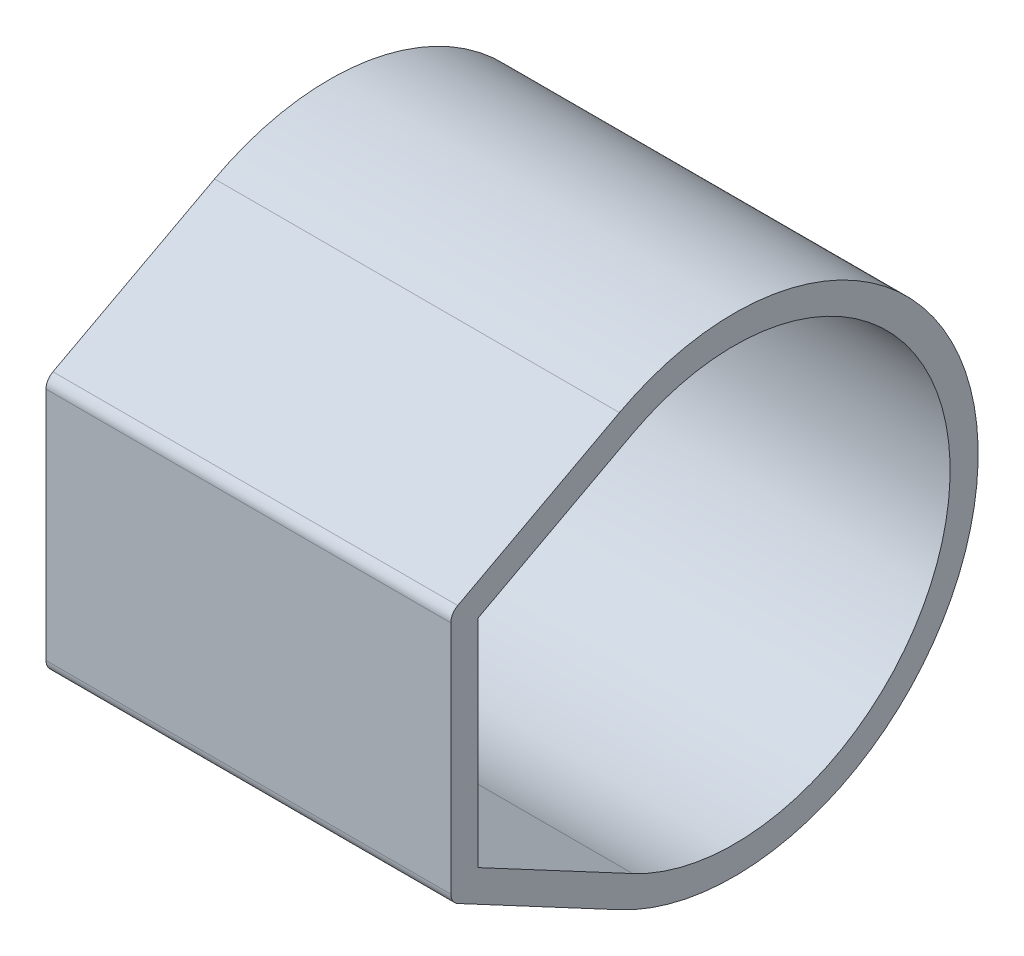
ISO-10303-21;
HEADER;
FILE_DESCRIPTION(('STEP AP214'),'2;1');
FILE_NAME('part.step','',(''),(''),'','','');
FILE_SCHEMA(('AUTOMOTIVE_DESIGN { 1 0 10303 214 1 1 1 1 }'));
ENDSEC;
DATA;
#1=APPLICATION_CONTEXT('core data for automotive mechanical design processes');
#2=APPLICATION_PROTOCOL_DEFINITION('international standard','automotive_design',2000,#1);
#3=PRODUCT_CONTEXT('',#1,'mechanical');
#4=PRODUCT('Part','Part','',(#3));
#5=PRODUCT_RELATED_PRODUCT_CATEGORY('part','',(#4));
#6=PRODUCT_DEFINITION_FORMATION('','',#4);
#7=PRODUCT_DEFINITION_CONTEXT('part definition',#1,'design');
#8=PRODUCT_DEFINITION('design','',#6,#7);
#9=PRODUCT_DEFINITION_SHAPE('','',#8);
#10=(LENGTH_UNIT() NAMED_UNIT(*) SI_UNIT(.MILLI.,.METRE.));
#11=(NAMED_UNIT(*) PLANE_ANGLE_UNIT() SI_UNIT($,.RADIAN.));
#12=(NAMED_UNIT(*) SI_UNIT($,.STERADIAN.) SOLID_ANGLE_UNIT());
#13=UNCERTAINTY_MEASURE_WITH_UNIT(LENGTH_MEASURE(1.E-05),#10,'distance_accuracy_value','');
#14=(GEOMETRIC_REPRESENTATION_CONTEXT(3) GLOBAL_UNCERTAINTY_ASSIGNED_CONTEXT((#13)) GLOBAL_UNIT_ASSIGNED_CONTEXT((#10,
#11,#12)) REPRESENTATION_CONTEXT('',''));
#15=CARTESIAN_POINT('',(0.,0.,0.));
#16=DIRECTION('',(0.,0.,1.));
#17=DIRECTION('',(1.,0.,0.));
#18=AXIS2_PLACEMENT_3D('',#15,#16,#17);
#19=CARTESIAN_POINT('',(-139.007123161513,665.110935184198,-377.797185138635));
#20=DIRECTION('',(-1.,0.,0.));
#21=DIRECTION('',(0.,0.,1.));
#22=AXIS2_PLACEMENT_3D('',#19,#20,#21);
#23=CYLINDRICAL_SURFACE('',#22,9.03898198734247);
#24=CARTESIAN_POINT('',(-154.007123161513,665.110935184198,-377.797185138635));
#25=DIRECTION('',(-1.,0.,0.));
#26=DIRECTION('',(0.,0.,1.));
#27=AXIS2_PLACEMENT_3D('',#24,#25,#26);
#28=CIRCLE('',#27,9.03898198734247);
#29=CARTESIAN_POINT('',(-154.007123161513,673.08650752597,-373.543546556356));
#30=VERTEX_POINT('',#29);
#31=CARTESIAN_POINT('',(-154.007123161513,657.135362842425,-373.543546556356));
#32=VERTEX_POINT('',#31);
#33=EDGE_CURVE('E164',#30,#32,#28,.T.);
#34=ORIENTED_EDGE('',*,*,#33,.F.);
#35=DIRECTION('',(-1.,0.,0.));
#36=VECTOR('',#35,1.);
#37=CARTESIAN_POINT('',(-139.007123161513,673.08650752597,-373.543546556356));
#38=LINE('',#37,#36);
#39=CARTESIAN_POINT('',(-139.007123161513,673.08650752597,-373.543546556356));
#40=VERTEX_POINT('',#39);
#41=EDGE_CURVE('E11',#40,#30,#38,.T.);
#42=ORIENTED_EDGE('',*,*,#41,.F.);
#43=CARTESIAN_POINT('',(-139.007123161513,665.110935184198,-377.797185138635));
#44=DIRECTION('',(-1.,0.,0.));
#45=DIRECTION('',(0.,0.,1.));
#46=AXIS2_PLACEMENT_3D('',#43,#44,#45);
#47=CIRCLE('',#46,9.03898198734247);
#48=CARTESIAN_POINT('',(-139.007123161513,657.135362842425,-373.543546556356));
#49=VERTEX_POINT('',#48);
#50=EDGE_CURVE('E170',#40,#49,#47,.T.);
#51=ORIENTED_EDGE('',*,*,#50,.T.);
#52=DIRECTION('',(-1.,0.,0.));
#53=VECTOR('',#52,1.);
#54=CARTESIAN_POINT('',(-139.007123161513,657.135362842425,-373.543546556356));
#55=LINE('',#54,#53);
#56=EDGE_CURVE('E46',#49,#32,#55,.T.);
#57=ORIENTED_EDGE('',*,*,#56,.T.);
#58=EDGE_LOOP('',(#34,#42,#51,#57));
#59=FACE_BOUND('',#58,.T.);
#60=ADVANCED_FACE('F43',(#59),#23,.T.);
#61=CARTESIAN_POINT('',(-139.007123161513,669.892133468441,-367.554095198489));
#62=DIRECTION('',(0.,0.882352941176468,0.470588235294123));
#63=DIRECTION('',(0.,-0.470588235294123,0.882352941176468));
#64=AXIS2_PLACEMENT_3D('',#61,#62,#63);
#65=PLANE('',#64);
#66=DIRECTION('',(0.,0.470588235294123,-0.882352941176468));
#67=VECTOR('',#66,1.);
#68=CARTESIAN_POINT('',(-154.007123161513,669.892133468441,-367.554095198489));
#69=LINE('',#68,#67);
#70=CARTESIAN_POINT('',(-154.007123161513,669.892133468441,-367.554095198489));
#71=VERTEX_POINT('',#70);
#72=EDGE_CURVE('E175',#71,#30,#69,.T.);
#73=ORIENTED_EDGE('',*,*,#72,.F.);
#74=DIRECTION('',(-1.,0.,0.));
#75=VECTOR('',#74,1.);
#76=CARTESIAN_POINT('',(-139.007123161513,669.892133468441,-367.554095198489));
#77=LINE('',#76,#75);
#78=CARTESIAN_POINT('',(-139.007123161513,669.892133468441,-367.554095198489));
#79=VERTEX_POINT('',#78);
#80=EDGE_CURVE('E52',#79,#71,#77,.T.);
#81=ORIENTED_EDGE('',*,*,#80,.F.);
#82=DIRECTION('',(0.,0.470588235294123,-0.882352941176468));
#83=VECTOR('',#82,1.);
#84=CARTESIAN_POINT('',(-139.007123161513,669.892133468441,-367.554095198489));
#85=LINE('',#84,#83);
#86=EDGE_CURVE('E191',#79,#40,#85,.T.);
#87=ORIENTED_EDGE('',*,*,#86,.T.);
#88=ORIENTED_EDGE('',*,*,#41,.T.);
#89=EDGE_LOOP('',(#73,#81,#87,#88));
#90=FACE_BOUND('',#89,.T.);
#91=ADVANCED_FACE('F240',(#90),#65,.T.);
#92=CARTESIAN_POINT('',(-139.007123161513,669.463950035351,-367.782459696137));
#93=DIRECTION('',(-1.,0.,0.));
#94=DIRECTION('',(0.,0.,1.));
#95=AXIS2_PLACEMENT_3D('',#92,#93,#94);
#96=CYLINDRICAL_SURFACE('',#95,0.485274557501719);
#97=CARTESIAN_POINT('',(-154.007123161513,669.463950035351,-367.782459696137));
#98=DIRECTION('',(-1.,0.,0.));
#99=DIRECTION('',(0.,0.,1.));
#100=AXIS2_PLACEMENT_3D('',#97,#98,#99);
#101=CIRCLE('',#100,0.485274557501719);
#102=CARTESIAN_POINT('',(-154.007123161513,669.463950035351,-367.297185138635));
#103=VERTEX_POINT('',#102);
#104=EDGE_CURVE('E210',#103,#71,#101,.T.);
#105=ORIENTED_EDGE('',*,*,#104,.F.);
#106=DIRECTION('',(-1.,0.,0.));
#107=VECTOR('',#106,1.);
#108=CARTESIAN_POINT('',(-139.007123161513,669.463950035351,-367.297185138635));
#109=LINE('',#108,#107);
#110=CARTESIAN_POINT('',(-139.007123161513,669.463950035351,-367.297185138635));
#111=VERTEX_POINT('',#110);
#112=EDGE_CURVE('E219',#111,#103,#109,.T.);
#113=ORIENTED_EDGE('',*,*,#112,.F.);
#114=CARTESIAN_POINT('',(-139.007123161513,669.463950035351,-367.782459696137));
#115=DIRECTION('',(-1.,0.,0.));
#116=DIRECTION('',(0.,0.,1.));
#117=AXIS2_PLACEMENT_3D('',#114,#115,#116);
#118=CIRCLE('',#117,0.485274557501719);
#119=EDGE_CURVE('E187',#111,#79,#118,.T.);
#120=ORIENTED_EDGE('',*,*,#119,.T.);
#121=ORIENTED_EDGE('',*,*,#80,.T.);
#122=EDGE_LOOP('',(#105,#113,#120,#121));
#123=FACE_BOUND('',#122,.T.);
#124=ADVANCED_FACE('F251',(#123),#96,.T.);
#125=CARTESIAN_POINT('',(-139.007123161513,660.757920333044,-367.297185138635));
#126=DIRECTION('',(0.,0.,1.));
#127=DIRECTION('',(1.,0.,0.));
#128=AXIS2_PLACEMENT_3D('',#125,#126,#127);
#129=PLANE('',#128);
#130=DIRECTION('',(0.,1.,0.));
#131=VECTOR('',#130,1.);
#132=CARTESIAN_POINT('',(-154.007123161513,660.757920333044,-367.297185138635));
#133=LINE('',#132,#131);
#134=CARTESIAN_POINT('',(-154.007123161513,660.757920333044,-367.297185138635));
#135=VERTEX_POINT('',#134);
#136=EDGE_CURVE('E206',#135,#103,#133,.T.);
#137=ORIENTED_EDGE('',*,*,#136,.F.);
#138=DIRECTION('',(-1.,0.,0.));
#139=VECTOR('',#138,1.);
#140=CARTESIAN_POINT('',(-139.007123161513,660.757920333044,-367.297185138635));
#141=LINE('',#140,#139);
#142=CARTESIAN_POINT('',(-139.007123161513,660.757920333044,-367.297185138635));
#143=VERTEX_POINT('',#142);
#144=EDGE_CURVE('E222',#143,#135,#141,.T.);
#145=ORIENTED_EDGE('',*,*,#144,.F.);
#146=DIRECTION('',(0.,1.,0.));
#147=VECTOR('',#146,1.);
#148=CARTESIAN_POINT('',(-139.007123161513,660.757920333044,-367.297185138635));
#149=LINE('',#148,#147);
#150=EDGE_CURVE('E183',#143,#111,#149,.T.);
#151=ORIENTED_EDGE('',*,*,#150,.T.);
#152=ORIENTED_EDGE('',*,*,#112,.T.);
#153=EDGE_LOOP('',(#137,#145,#151,#152));
#154=FACE_BOUND('',#153,.T.);
#155=ADVANCED_FACE('F249',(#154),#129,.T.);
#156=CARTESIAN_POINT('',(-139.007123161513,660.757920333044,-367.782459696137));
#157=DIRECTION('',(-1.,0.,0.));
#158=DIRECTION('',(0.,0.,1.));
#159=AXIS2_PLACEMENT_3D('',#156,#157,#158);
#160=CYLINDRICAL_SURFACE('',#159,0.485274557501768);
#161=CARTESIAN_POINT('',(-154.007123161513,660.757920333044,-367.782459696137));
#162=DIRECTION('',(-1.,0.,0.));
#163=DIRECTION('',(0.,0.,1.));
#164=AXIS2_PLACEMENT_3D('',#161,#162,#163);
#165=CIRCLE('',#164,0.485274557501768);
#166=CARTESIAN_POINT('',(-154.007123161513,660.329736899954,-367.554095198489));
#167=VERTEX_POINT('',#166);
#168=EDGE_CURVE('E202',#167,#135,#165,.T.);
#169=ORIENTED_EDGE('',*,*,#168,.F.);
#170=DIRECTION('',(-1.,0.,0.));
#171=VECTOR('',#170,1.);
#172=CARTESIAN_POINT('',(-139.007123161513,660.329736899954,-367.554095198489));
#173=LINE('',#172,#171);
#174=CARTESIAN_POINT('',(-139.007123161513,660.329736899954,-367.554095198489));
#175=VERTEX_POINT('',#174);
#176=EDGE_CURVE('E224',#175,#167,#173,.T.);
#177=ORIENTED_EDGE('',*,*,#176,.F.);
#178=CARTESIAN_POINT('',(-139.007123161513,660.757920333044,-367.782459696137));
#179=DIRECTION('',(-1.,0.,0.));
#180=DIRECTION('',(0.,0.,1.));
#181=AXIS2_PLACEMENT_3D('',#178,#179,#180);
#182=CIRCLE('',#181,0.485274557501768);
#183=EDGE_CURVE('E179',#175,#143,#182,.T.);
#184=ORIENTED_EDGE('',*,*,#183,.T.);
#185=ORIENTED_EDGE('',*,*,#144,.T.);
#186=EDGE_LOOP('',(#169,#177,#184,#185));
#187=FACE_BOUND('',#186,.T.);
#188=ADVANCED_FACE('F246',(#187),#160,.T.);
#189=CARTESIAN_POINT('',(-139.007123161513,657.135362842425,-373.543546556356));
#190=DIRECTION('',(0.,-0.882352941176466,0.470588235294126));
#191=DIRECTION('',(0.,-0.470588235294126,-0.882352941176466));
#192=AXIS2_PLACEMENT_3D('',#189,#190,#191);
#193=PLANE('',#192);
#194=DIRECTION('',(0.,0.470588235294126,0.882352941176466));
#195=VECTOR('',#194,1.);
#196=CARTESIAN_POINT('',(-154.007123161513,657.135362842425,-373.543546556356));
#197=LINE('',#196,#195);
#198=EDGE_CURVE('E198',#32,#167,#197,.T.);
#199=ORIENTED_EDGE('',*,*,#198,.F.);
#200=ORIENTED_EDGE('',*,*,#56,.F.);
#201=DIRECTION('',(0.,0.470588235294126,0.882352941176466));
#202=VECTOR('',#201,1.);
#203=CARTESIAN_POINT('',(-139.007123161513,657.135362842425,-373.543546556356));
#204=LINE('',#203,#202);
#205=EDGE_CURVE('E174',#49,#175,#204,.T.);
#206=ORIENTED_EDGE('',*,*,#205,.T.);
#207=ORIENTED_EDGE('',*,*,#176,.T.);
#208=EDGE_LOOP('',(#199,#200,#206,#207));
#209=FACE_BOUND('',#208,.T.);
#210=ADVANCED_FACE('F234',(#209),#193,.T.);
#211=CARTESIAN_POINT('',(-139.007123161513,665.110935184198,-377.797185138635));
#212=DIRECTION('',(-1.,0.,0.));
#213=DIRECTION('',(0.,0.,1.));
#214=AXIS2_PLACEMENT_3D('',#211,#212,#213);
#215=PLANE('',#214);
#216=DIRECTION('',(0.,0.470588235294119,-0.88235294117647));
#217=VECTOR('',#216,1.);
#218=CARTESIAN_POINT('',(-139.007123161513,672.169758713609,-374.032479256282));
#219=LINE('',#218,#217);
#220=CARTESIAN_POINT('',(-139.007123161513,669.110935184198,-368.297185138635));
#221=VERTEX_POINT('',#220);
#222=CARTESIAN_POINT('',(-139.007123161513,672.169758713609,-374.032479256282));
#223=VERTEX_POINT('',#222);
#224=EDGE_CURVE('E130',#221,#223,#219,.T.);
#225=ORIENTED_EDGE('',*,*,#224,.T.);
#226=CARTESIAN_POINT('',(-139.007123161513,665.110935184198,-377.797185138635));
#227=DIRECTION('',(-1.,0.,0.));
#228=DIRECTION('',(0.,0.,-1.));
#229=AXIS2_PLACEMENT_3D('',#226,#227,#228);
#230=CIRCLE('',#229,7.99999999999996);
#231=CARTESIAN_POINT('',(-139.007123161513,658.052111654786,-374.032479256282));
#232=VERTEX_POINT('',#231);
#233=EDGE_CURVE('E123',#223,#232,#230,.T.);
#234=ORIENTED_EDGE('',*,*,#233,.T.);
#235=DIRECTION('',(0.,0.470588235294103,0.882352941176479));
#236=VECTOR('',#235,1.);
#237=CARTESIAN_POINT('',(-139.007123161513,661.110935184198,-368.297185138635));
#238=LINE('',#237,#236);
#239=CARTESIAN_POINT('',(-139.007123161513,661.110935184197,-368.297185138635));
#240=VERTEX_POINT('',#239);
#241=EDGE_CURVE('E133',#232,#240,#238,.T.);
#242=ORIENTED_EDGE('',*,*,#241,.T.);
#243=DIRECTION('',(0.,1.,0.));
#244=VECTOR('',#243,1.);
#245=CARTESIAN_POINT('',(-139.007123161513,669.110935184198,-368.297185138635));
#246=LINE('',#245,#244);
#247=EDGE_CURVE('E60',#240,#221,#246,.T.);
#248=ORIENTED_EDGE('',*,*,#247,.T.);
#249=EDGE_LOOP('',(#225,#234,#242,#248));
#250=FACE_BOUND('',#249,.T.);
#251=ORIENTED_EDGE('',*,*,#50,.F.);
#252=ORIENTED_EDGE('',*,*,#86,.F.);
#253=ORIENTED_EDGE('',*,*,#119,.F.);
#254=ORIENTED_EDGE('',*,*,#150,.F.);
#255=ORIENTED_EDGE('',*,*,#183,.F.);
#256=ORIENTED_EDGE('',*,*,#205,.F.);
#257=EDGE_LOOP('',(#251,#252,#253,#254,#255,#256));
#258=FACE_BOUND('',#257,.T.);
#259=ADVANCED_FACE('F138',(#250,#258),#215,.F.);
#260=CARTESIAN_POINT('',(-154.007123161513,665.110935184198,-377.797185138635));
#261=DIRECTION('',(-1.,0.,0.));
#262=DIRECTION('',(0.,0.,1.));
#263=AXIS2_PLACEMENT_3D('',#260,#261,#262);
#264=PLANE('',#263);
#265=CARTESIAN_POINT('',(-154.007123161513,665.110935184198,-377.797185138635));
#266=DIRECTION('',(-1.,0.,0.));
#267=DIRECTION('',(0.,0.,-1.));
#268=AXIS2_PLACEMENT_3D('',#265,#266,#267);
#269=CIRCLE('',#268,7.99999999999996);
#270=CARTESIAN_POINT('',(-154.007123161513,672.169758713609,-374.032479256282));
#271=VERTEX_POINT('',#270);
#272=CARTESIAN_POINT('',(-154.007123161513,658.052111654786,-374.032479256282));
#273=VERTEX_POINT('',#272);
#274=EDGE_CURVE('E68',#271,#273,#269,.T.);
#275=ORIENTED_EDGE('',*,*,#274,.F.);
#276=DIRECTION('',(0.,0.470588235294119,-0.88235294117647));
#277=VECTOR('',#276,1.);
#278=CARTESIAN_POINT('',(-154.007123161513,672.169758713609,-374.032479256282));
#279=LINE('',#278,#277);
#280=CARTESIAN_POINT('',(-154.007123161513,669.110935184198,-368.297185138635));
#281=VERTEX_POINT('',#280);
#282=EDGE_CURVE('E142',#281,#271,#279,.T.);
#283=ORIENTED_EDGE('',*,*,#282,.F.);
#284=DIRECTION('',(0.,1.,0.));
#285=VECTOR('',#284,1.);
#286=CARTESIAN_POINT('',(-154.007123161513,669.110935184198,-368.297185138635));
#287=LINE('',#286,#285);
#288=CARTESIAN_POINT('',(-154.007123161513,661.110935184198,-368.297185138635));
#289=VERTEX_POINT('',#288);
#290=EDGE_CURVE('E146',#289,#281,#287,.T.);
#291=ORIENTED_EDGE('',*,*,#290,.F.);
#292=DIRECTION('',(0.,0.470588235294103,0.882352941176479));
#293=VECTOR('',#292,1.);
#294=CARTESIAN_POINT('',(-154.007123161513,661.110935184198,-368.297185138635));
#295=LINE('',#294,#293);
#296=EDGE_CURVE('E155',#273,#289,#295,.T.);
#297=ORIENTED_EDGE('',*,*,#296,.F.);
#298=EDGE_LOOP('',(#275,#283,#291,#297));
#299=FACE_BOUND('',#298,.T.);
#300=ORIENTED_EDGE('',*,*,#33,.T.);
#301=ORIENTED_EDGE('',*,*,#198,.T.);
#302=ORIENTED_EDGE('',*,*,#168,.T.);
#303=ORIENTED_EDGE('',*,*,#136,.T.);
#304=ORIENTED_EDGE('',*,*,#104,.T.);
#305=ORIENTED_EDGE('',*,*,#72,.T.);
#306=EDGE_LOOP('',(#300,#301,#302,#303,#304,#305));
#307=FACE_BOUND('',#306,.T.);
#308=ADVANCED_FACE('F236',(#299,#307),#264,.T.);
#309=CARTESIAN_POINT('',(-139.007123161513,665.110935184198,-377.797185138635));
#310=DIRECTION('',(-1.,0.,0.));
#311=DIRECTION('',(0.,0.,1.));
#312=AXIS2_PLACEMENT_3D('',#309,#310,#311);
#313=CYLINDRICAL_SURFACE('',#312,7.99999999999996);
#314=ORIENTED_EDGE('',*,*,#274,.T.);
#315=DIRECTION('',(-1.,0.,0.));
#316=VECTOR('',#315,1.);
#317=CARTESIAN_POINT('',(-139.007123161513,658.052111654786,-374.032479256282));
#318=LINE('',#317,#316);
#319=EDGE_CURVE('E119',#232,#273,#318,.T.);
#320=ORIENTED_EDGE('',*,*,#319,.F.);
#321=ORIENTED_EDGE('',*,*,#233,.F.);
#322=DIRECTION('',(-1.,0.,0.));
#323=VECTOR('',#322,1.);
#324=CARTESIAN_POINT('',(-139.007123161513,672.169758713609,-374.032479256282));
#325=LINE('',#324,#323);
#326=EDGE_CURVE('E161',#223,#271,#325,.T.);
#327=ORIENTED_EDGE('',*,*,#326,.T.);
#328=EDGE_LOOP('',(#314,#320,#321,#327));
#329=FACE_BOUND('',#328,.T.);
#330=ADVANCED_FACE('F121',(#329),#313,.F.);
#331=CARTESIAN_POINT('',(-139.007123161513,672.169758713609,-374.032479256282));
#332=DIRECTION('',(0.,0.88235294117647,0.470588235294119));
#333=DIRECTION('',(0.,-0.47058823529412,0.88235294117647));
#334=AXIS2_PLACEMENT_3D('',#331,#332,#333);
#335=PLANE('',#334);
#336=ORIENTED_EDGE('',*,*,#282,.T.);
#337=ORIENTED_EDGE('',*,*,#326,.F.);
#338=ORIENTED_EDGE('',*,*,#224,.F.);
#339=DIRECTION('',(-1.,0.,0.));
#340=VECTOR('',#339,1.);
#341=CARTESIAN_POINT('',(-139.007123161513,669.110935184198,-368.297185138635));
#342=LINE('',#341,#340);
#343=EDGE_CURVE('E165',#221,#281,#342,.T.);
#344=ORIENTED_EDGE('',*,*,#343,.T.);
#345=EDGE_LOOP('',(#336,#337,#338,#344));
#346=FACE_BOUND('',#345,.T.);
#347=ADVANCED_FACE('F325',(#346),#335,.F.);
#348=CARTESIAN_POINT('',(-139.007123161513,669.110935184198,-368.297185138635));
#349=DIRECTION('',(0.,0.,1.));
#350=DIRECTION('',(1.,0.,0.));
#351=AXIS2_PLACEMENT_3D('',#348,#349,#350);
#352=PLANE('',#351);
#353=ORIENTED_EDGE('',*,*,#290,.T.);
#354=ORIENTED_EDGE('',*,*,#343,.F.);
#355=ORIENTED_EDGE('',*,*,#247,.F.);
#356=DIRECTION('',(-1.,0.,0.));
#357=VECTOR('',#356,1.);
#358=CARTESIAN_POINT('',(-139.007123161513,661.110935184198,-368.297185138635));
#359=LINE('',#358,#357);
#360=EDGE_CURVE('E129',#240,#289,#359,.T.);
#361=ORIENTED_EDGE('',*,*,#360,.T.);
#362=EDGE_LOOP('',(#353,#354,#355,#361));
#363=FACE_BOUND('',#362,.T.);
#364=ADVANCED_FACE('F335',(#363),#352,.F.);
#365=CARTESIAN_POINT('',(-139.007123161513,661.110935184198,-368.297185138635));
#366=DIRECTION('',(0.,-0.882352941176479,0.470588235294103));
#367=DIRECTION('',(0.,-0.470588235294103,-0.882352941176479));
#368=AXIS2_PLACEMENT_3D('',#365,#366,#367);
#369=PLANE('',#368);
#370=ORIENTED_EDGE('',*,*,#296,.T.);
#371=ORIENTED_EDGE('',*,*,#360,.F.);
#372=ORIENTED_EDGE('',*,*,#241,.F.);
#373=ORIENTED_EDGE('',*,*,#319,.T.);
#374=EDGE_LOOP('',(#370,#371,#372,#373));
#375=FACE_BOUND('',#374,.T.);
#376=ADVANCED_FACE('F134',(#375),#369,.F.);
#377=CLOSED_SHELL('',(#60,#91,#124,#155,#188,#210,#259,#308,#330,#347,#364,#376));
#378=MANIFOLD_SOLID_BREP('B2',#377);
#379=ADVANCED_BREP_SHAPE_REPRESENTATION('',(#18,#378),#14);
#380=SHAPE_DEFINITION_REPRESENTATION(#9,#379);
ENDSEC;
END-ISO-10303-21;
